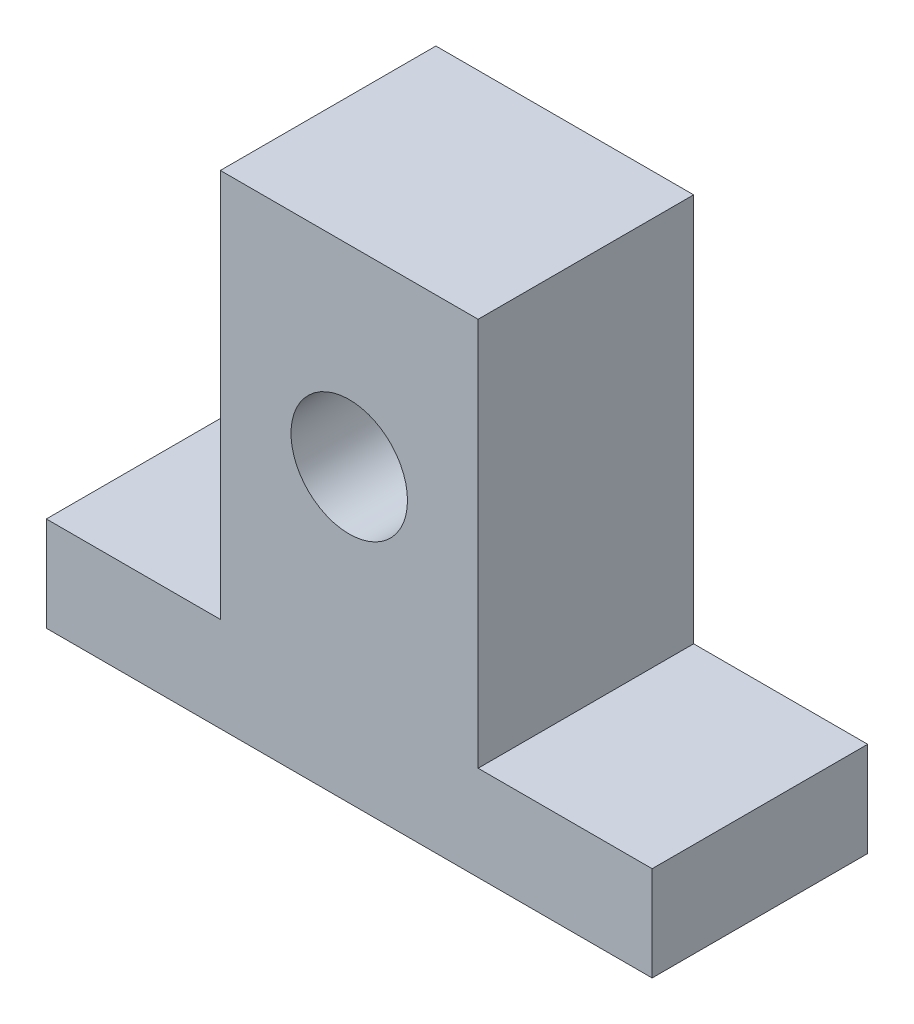
ISO-10303-21;
HEADER;
FILE_DESCRIPTION(('STEP AP214'),'2;1');
FILE_NAME('part.step','',(''),(''),'','','');
FILE_SCHEMA(('AUTOMOTIVE_DESIGN { 1 0 10303 214 1 1 1 1 }'));
ENDSEC;
DATA;
#1=APPLICATION_CONTEXT('core data for automotive mechanical design processes');
#2=APPLICATION_PROTOCOL_DEFINITION('international standard','automotive_design',2000,#1);
#3=PRODUCT_CONTEXT('',#1,'mechanical');
#4=PRODUCT('Part','Part','',(#3));
#5=PRODUCT_RELATED_PRODUCT_CATEGORY('part','',(#4));
#6=PRODUCT_DEFINITION_FORMATION('','',#4);
#7=PRODUCT_DEFINITION_CONTEXT('part definition',#1,'design');
#8=PRODUCT_DEFINITION('design','',#6,#7);
#9=PRODUCT_DEFINITION_SHAPE('','',#8);
#10=(LENGTH_UNIT() NAMED_UNIT(*) SI_UNIT(.MILLI.,.METRE.));
#11=(NAMED_UNIT(*) PLANE_ANGLE_UNIT() SI_UNIT($,.RADIAN.));
#12=(NAMED_UNIT(*) SI_UNIT($,.STERADIAN.) SOLID_ANGLE_UNIT());
#13=UNCERTAINTY_MEASURE_WITH_UNIT(LENGTH_MEASURE(1.E-05),#10,'distance_accuracy_value','');
#14=(GEOMETRIC_REPRESENTATION_CONTEXT(3) GLOBAL_UNCERTAINTY_ASSIGNED_CONTEXT((#13)) GLOBAL_UNIT_ASSIGNED_CONTEXT((#10,
#11,#12)) REPRESENTATION_CONTEXT('',''));
#15=CARTESIAN_POINT('',(0.,0.,0.));
#16=DIRECTION('',(0.,0.,1.));
#17=DIRECTION('',(1.,0.,0.));
#18=AXIS2_PLACEMENT_3D('',#15,#16,#17);
#19=CARTESIAN_POINT('',(0.,0.,14.8));
#20=DIRECTION('',(0.,0.,1.));
#21=DIRECTION('',(1.,0.,0.));
#22=AXIS2_PLACEMENT_3D('',#19,#20,#21);
#23=PLANE('',#22);
#24=DIRECTION('',(0.,-1.,0.));
#25=VECTOR('',#24,1.);
#26=CARTESIAN_POINT('',(-20.8,6.5,14.8));
#27=LINE('',#26,#25);
#28=CARTESIAN_POINT('',(-20.8,6.5,14.8));
#29=VERTEX_POINT('',#28);
#30=CARTESIAN_POINT('',(-20.8,0.,14.8));
#31=VERTEX_POINT('',#30);
#32=EDGE_CURVE('E164',#29,#31,#27,.T.);
#33=ORIENTED_EDGE('',*,*,#32,.T.);
#34=DIRECTION('',(1.,0.,0.));
#35=VECTOR('',#34,1.);
#36=CARTESIAN_POINT('',(-20.8,0.,14.8));
#37=LINE('',#36,#35);
#38=CARTESIAN_POINT('',(20.8,0.,14.8));
#39=VERTEX_POINT('',#38);
#40=EDGE_CURVE('E100',#31,#39,#37,.T.);
#41=ORIENTED_EDGE('',*,*,#40,.T.);
#42=DIRECTION('',(0.,1.,0.));
#43=VECTOR('',#42,1.);
#44=CARTESIAN_POINT('',(20.8,0.,14.8));
#45=LINE('',#44,#43);
#46=CARTESIAN_POINT('',(20.8,6.5,14.8));
#47=VERTEX_POINT('',#46);
#48=EDGE_CURVE('E185',#39,#47,#45,.T.);
#49=ORIENTED_EDGE('',*,*,#48,.T.);
#50=DIRECTION('',(-1.,0.,0.));
#51=VECTOR('',#50,1.);
#52=CARTESIAN_POINT('',(20.8,6.5,14.8));
#53=LINE('',#52,#51);
#54=CARTESIAN_POINT('',(8.85,6.5,14.8));
#55=VERTEX_POINT('',#54);
#56=EDGE_CURVE('E199',#47,#55,#53,.T.);
#57=ORIENTED_EDGE('',*,*,#56,.T.);
#58=DIRECTION('',(0.,1.,0.));
#59=VECTOR('',#58,1.);
#60=CARTESIAN_POINT('',(8.85,6.5,14.8));
#61=LINE('',#60,#59);
#62=CARTESIAN_POINT('',(8.85,33.2,14.8));
#63=VERTEX_POINT('',#62);
#64=EDGE_CURVE('E119',#55,#63,#61,.T.);
#65=ORIENTED_EDGE('',*,*,#64,.T.);
#66=DIRECTION('',(-1.,0.,0.));
#67=VECTOR('',#66,1.);
#68=CARTESIAN_POINT('',(8.85,33.2,14.8));
#69=LINE('',#68,#67);
#70=CARTESIAN_POINT('',(-8.85,33.2,14.8));
#71=VERTEX_POINT('',#70);
#72=EDGE_CURVE('E113',#63,#71,#69,.T.);
#73=ORIENTED_EDGE('',*,*,#72,.T.);
#74=DIRECTION('',(0.,-1.,0.));
#75=VECTOR('',#74,1.);
#76=CARTESIAN_POINT('',(-8.85,33.2,14.8));
#77=LINE('',#76,#75);
#78=CARTESIAN_POINT('',(-8.85,6.5,14.8));
#79=VERTEX_POINT('',#78);
#80=EDGE_CURVE('E117',#71,#79,#77,.T.);
#81=ORIENTED_EDGE('',*,*,#80,.T.);
#82=DIRECTION('',(-1.,0.,0.));
#83=VECTOR('',#82,1.);
#84=CARTESIAN_POINT('',(-8.85,6.5,14.8));
#85=LINE('',#84,#83);
#86=EDGE_CURVE('E57',#79,#29,#85,.T.);
#87=ORIENTED_EDGE('',*,*,#86,.T.);
#88=EDGE_LOOP('',(#33,#41,#49,#57,#65,#73,#81,#87));
#89=FACE_BOUND('',#88,.T.);
#90=CARTESIAN_POINT('',(0.,20.,14.8));
#91=DIRECTION('',(0.,0.,1.));
#92=DIRECTION('',(1.,0.,0.));
#93=AXIS2_PLACEMENT_3D('',#90,#91,#92);
#94=CIRCLE('',#93,4.);
#95=CARTESIAN_POINT('',(4.,20.,14.8));
#96=VERTEX_POINT('',#95);
#97=EDGE_CURVE('E146',#96,#96,#94,.T.);
#98=ORIENTED_EDGE('',*,*,#97,.F.);
#99=EDGE_LOOP('',(#98));
#100=FACE_BOUND('',#99,.T.);
#101=ADVANCED_FACE('F39',(#89,#100),#23,.T.);
#102=CARTESIAN_POINT('',(0.,0.,0.));
#103=DIRECTION('',(0.,0.,1.));
#104=DIRECTION('',(1.,0.,0.));
#105=AXIS2_PLACEMENT_3D('',#102,#103,#104);
#106=PLANE('',#105);
#107=DIRECTION('',(0.,-1.,0.));
#108=VECTOR('',#107,1.);
#109=CARTESIAN_POINT('',(-20.8,6.5,0.));
#110=LINE('',#109,#108);
#111=CARTESIAN_POINT('',(-20.8,6.5,0.));
#112=VERTEX_POINT('',#111);
#113=CARTESIAN_POINT('',(-20.8,0.,0.));
#114=VERTEX_POINT('',#113);
#115=EDGE_CURVE('E141',#112,#114,#110,.T.);
#116=ORIENTED_EDGE('',*,*,#115,.F.);
#117=DIRECTION('',(-1.,0.,0.));
#118=VECTOR('',#117,1.);
#119=CARTESIAN_POINT('',(-8.85,6.5,0.));
#120=LINE('',#119,#118);
#121=CARTESIAN_POINT('',(-8.85,6.5,0.));
#122=VERTEX_POINT('',#121);
#123=EDGE_CURVE('E92',#122,#112,#120,.T.);
#124=ORIENTED_EDGE('',*,*,#123,.F.);
#125=DIRECTION('',(0.,-1.,0.));
#126=VECTOR('',#125,1.);
#127=CARTESIAN_POINT('',(-8.85,33.2,0.));
#128=LINE('',#127,#126);
#129=CARTESIAN_POINT('',(-8.85,33.2,0.));
#130=VERTEX_POINT('',#129);
#131=EDGE_CURVE('E86',#130,#122,#128,.T.);
#132=ORIENTED_EDGE('',*,*,#131,.F.);
#133=DIRECTION('',(-1.,0.,0.));
#134=VECTOR('',#133,1.);
#135=CARTESIAN_POINT('',(8.85,33.2,0.));
#136=LINE('',#135,#134);
#137=CARTESIAN_POINT('',(8.85,33.2,0.));
#138=VERTEX_POINT('',#137);
#139=EDGE_CURVE('E128',#138,#130,#136,.T.);
#140=ORIENTED_EDGE('',*,*,#139,.F.);
#141=DIRECTION('',(0.,1.,0.));
#142=VECTOR('',#141,1.);
#143=CARTESIAN_POINT('',(8.85,6.5,0.));
#144=LINE('',#143,#142);
#145=CARTESIAN_POINT('',(8.85,6.5,0.));
#146=VERTEX_POINT('',#145);
#147=EDGE_CURVE('E155',#146,#138,#144,.T.);
#148=ORIENTED_EDGE('',*,*,#147,.F.);
#149=DIRECTION('',(-1.,0.,0.));
#150=VECTOR('',#149,1.);
#151=CARTESIAN_POINT('',(20.8,6.5,0.));
#152=LINE('',#151,#150);
#153=CARTESIAN_POINT('',(20.8,6.5,0.));
#154=VERTEX_POINT('',#153);
#155=EDGE_CURVE('E152',#154,#146,#152,.T.);
#156=ORIENTED_EDGE('',*,*,#155,.F.);
#157=DIRECTION('',(0.,1.,0.));
#158=VECTOR('',#157,1.);
#159=CARTESIAN_POINT('',(20.8,0.,0.));
#160=LINE('',#159,#158);
#161=CARTESIAN_POINT('',(20.8,0.,0.));
#162=VERTEX_POINT('',#161);
#163=EDGE_CURVE('E149',#162,#154,#160,.T.);
#164=ORIENTED_EDGE('',*,*,#163,.F.);
#165=DIRECTION('',(1.,0.,0.));
#166=VECTOR('',#165,1.);
#167=CARTESIAN_POINT('',(-20.8,0.,0.));
#168=LINE('',#167,#166);
#169=EDGE_CURVE('E145',#114,#162,#168,.T.);
#170=ORIENTED_EDGE('',*,*,#169,.F.);
#171=EDGE_LOOP('',(#116,#124,#132,#140,#148,#156,#164,#170));
#172=FACE_BOUND('',#171,.T.);
#173=CARTESIAN_POINT('',(0.,20.,0.));
#174=DIRECTION('',(0.,0.,1.));
#175=DIRECTION('',(1.,0.,0.));
#176=AXIS2_PLACEMENT_3D('',#173,#174,#175);
#177=CIRCLE('',#176,4.);
#178=CARTESIAN_POINT('',(4.,20.,0.));
#179=VERTEX_POINT('',#178);
#180=EDGE_CURVE('E209',#179,#179,#177,.T.);
#181=ORIENTED_EDGE('',*,*,#180,.T.);
#182=EDGE_LOOP('',(#181));
#183=FACE_BOUND('',#182,.T.);
#184=ADVANCED_FACE('F189',(#172,#183),#106,.F.);
#185=CARTESIAN_POINT('',(-20.8,6.5,14.8));
#186=DIRECTION('',(1.,0.,0.));
#187=DIRECTION('',(0.,0.,-1.));
#188=AXIS2_PLACEMENT_3D('',#185,#186,#187);
#189=PLANE('',#188);
#190=ORIENTED_EDGE('',*,*,#115,.T.);
#191=DIRECTION('',(0.,0.,-1.));
#192=VECTOR('',#191,1.);
#193=CARTESIAN_POINT('',(-20.8,0.,14.8));
#194=LINE('',#193,#192);
#195=EDGE_CURVE('E11',#31,#114,#194,.T.);
#196=ORIENTED_EDGE('',*,*,#195,.F.);
#197=ORIENTED_EDGE('',*,*,#32,.F.);
#198=DIRECTION('',(0.,0.,-1.));
#199=VECTOR('',#198,1.);
#200=CARTESIAN_POINT('',(-20.8,6.5,14.8));
#201=LINE('',#200,#199);
#202=EDGE_CURVE('E137',#29,#112,#201,.T.);
#203=ORIENTED_EDGE('',*,*,#202,.T.);
#204=EDGE_LOOP('',(#190,#196,#197,#203));
#205=FACE_BOUND('',#204,.T.);
#206=ADVANCED_FACE('F41',(#205),#189,.F.);
#207=CARTESIAN_POINT('',(-20.8,0.,14.8));
#208=DIRECTION('',(0.,1.,0.));
#209=DIRECTION('',(-1.,0.,0.));
#210=AXIS2_PLACEMENT_3D('',#207,#208,#209);
#211=PLANE('',#210);
#212=ORIENTED_EDGE('',*,*,#169,.T.);
#213=DIRECTION('',(0.,0.,-1.));
#214=VECTOR('',#213,1.);
#215=CARTESIAN_POINT('',(20.8,0.,14.8));
#216=LINE('',#215,#214);
#217=EDGE_CURVE('E49',#39,#162,#216,.T.);
#218=ORIENTED_EDGE('',*,*,#217,.F.);
#219=ORIENTED_EDGE('',*,*,#40,.F.);
#220=ORIENTED_EDGE('',*,*,#195,.T.);
#221=EDGE_LOOP('',(#212,#218,#219,#220));
#222=FACE_BOUND('',#221,.T.);
#223=ADVANCED_FACE('F239',(#222),#211,.F.);
#224=CARTESIAN_POINT('',(20.8,0.,14.8));
#225=DIRECTION('',(-1.,0.,0.));
#226=DIRECTION('',(0.,0.,1.));
#227=AXIS2_PLACEMENT_3D('',#224,#225,#226);
#228=PLANE('',#227);
#229=ORIENTED_EDGE('',*,*,#163,.T.);
#230=DIRECTION('',(0.,0.,-1.));
#231=VECTOR('',#230,1.);
#232=CARTESIAN_POINT('',(20.8,6.5,14.8));
#233=LINE('',#232,#231);
#234=EDGE_CURVE('E175',#47,#154,#233,.T.);
#235=ORIENTED_EDGE('',*,*,#234,.F.);
#236=ORIENTED_EDGE('',*,*,#48,.F.);
#237=ORIENTED_EDGE('',*,*,#217,.T.);
#238=EDGE_LOOP('',(#229,#235,#236,#237));
#239=FACE_BOUND('',#238,.T.);
#240=ADVANCED_FACE('F183',(#239),#228,.F.);
#241=CARTESIAN_POINT('',(20.8,6.5,14.8));
#242=DIRECTION('',(0.,-1.,0.));
#243=DIRECTION('',(1.,0.,0.));
#244=AXIS2_PLACEMENT_3D('',#241,#242,#243);
#245=PLANE('',#244);
#246=ORIENTED_EDGE('',*,*,#155,.T.);
#247=DIRECTION('',(0.,0.,-1.));
#248=VECTOR('',#247,1.);
#249=CARTESIAN_POINT('',(8.85,6.5,14.8));
#250=LINE('',#249,#248);
#251=EDGE_CURVE('E171',#55,#146,#250,.T.);
#252=ORIENTED_EDGE('',*,*,#251,.F.);
#253=ORIENTED_EDGE('',*,*,#56,.F.);
#254=ORIENTED_EDGE('',*,*,#234,.T.);
#255=EDGE_LOOP('',(#246,#252,#253,#254));
#256=FACE_BOUND('',#255,.T.);
#257=ADVANCED_FACE('F194',(#256),#245,.F.);
#258=CARTESIAN_POINT('',(8.85,6.5,14.8));
#259=DIRECTION('',(-1.,0.,0.));
#260=DIRECTION('',(0.,-1.,0.));
#261=AXIS2_PLACEMENT_3D('',#258,#259,#260);
#262=PLANE('',#261);
#263=ORIENTED_EDGE('',*,*,#147,.T.);
#264=DIRECTION('',(0.,0.,-1.));
#265=VECTOR('',#264,1.);
#266=CARTESIAN_POINT('',(8.85,33.2,14.8));
#267=LINE('',#266,#265);
#268=EDGE_CURVE('E130',#63,#138,#267,.T.);
#269=ORIENTED_EDGE('',*,*,#268,.F.);
#270=ORIENTED_EDGE('',*,*,#64,.F.);
#271=ORIENTED_EDGE('',*,*,#251,.T.);
#272=EDGE_LOOP('',(#263,#269,#270,#271));
#273=FACE_BOUND('',#272,.T.);
#274=ADVANCED_FACE('F197',(#273),#262,.F.);
#275=CARTESIAN_POINT('',(8.85,33.2,14.8));
#276=DIRECTION('',(0.,-1.,0.));
#277=DIRECTION('',(0.,0.,-1.));
#278=AXIS2_PLACEMENT_3D('',#275,#276,#277);
#279=PLANE('',#278);
#280=ORIENTED_EDGE('',*,*,#139,.T.);
#281=DIRECTION('',(0.,0.,-1.));
#282=VECTOR('',#281,1.);
#283=CARTESIAN_POINT('',(-8.85,33.2,14.8));
#284=LINE('',#283,#282);
#285=EDGE_CURVE('E125',#71,#130,#284,.T.);
#286=ORIENTED_EDGE('',*,*,#285,.F.);
#287=ORIENTED_EDGE('',*,*,#72,.F.);
#288=ORIENTED_EDGE('',*,*,#268,.T.);
#289=EDGE_LOOP('',(#280,#286,#287,#288));
#290=FACE_BOUND('',#289,.T.);
#291=ADVANCED_FACE('F126',(#290),#279,.F.);
#292=CARTESIAN_POINT('',(-8.85,33.2,14.8));
#293=DIRECTION('',(1.,0.,0.));
#294=DIRECTION('',(0.,1.,0.));
#295=AXIS2_PLACEMENT_3D('',#292,#293,#294);
#296=PLANE('',#295);
#297=ORIENTED_EDGE('',*,*,#131,.T.);
#298=DIRECTION('',(0.,0.,-1.));
#299=VECTOR('',#298,1.);
#300=CARTESIAN_POINT('',(-8.85,6.5,14.8));
#301=LINE('',#300,#299);
#302=EDGE_CURVE('E131',#79,#122,#301,.T.);
#303=ORIENTED_EDGE('',*,*,#302,.F.);
#304=ORIENTED_EDGE('',*,*,#80,.F.);
#305=ORIENTED_EDGE('',*,*,#285,.T.);
#306=EDGE_LOOP('',(#297,#303,#304,#305));
#307=FACE_BOUND('',#306,.T.);
#308=ADVANCED_FACE('F133',(#307),#296,.F.);
#309=CARTESIAN_POINT('',(-8.85,6.5,14.8));
#310=DIRECTION('',(0.,-1.,0.));
#311=DIRECTION('',(1.,0.,0.));
#312=AXIS2_PLACEMENT_3D('',#309,#310,#311);
#313=PLANE('',#312);
#314=ORIENTED_EDGE('',*,*,#123,.T.);
#315=ORIENTED_EDGE('',*,*,#202,.F.);
#316=ORIENTED_EDGE('',*,*,#86,.F.);
#317=ORIENTED_EDGE('',*,*,#302,.T.);
#318=EDGE_LOOP('',(#314,#315,#316,#317));
#319=FACE_BOUND('',#318,.T.);
#320=ADVANCED_FACE('F227',(#319),#313,.F.);
#321=CARTESIAN_POINT('',(0.,20.,14.8));
#322=DIRECTION('',(0.,0.,-1.));
#323=DIRECTION('',(-1.,0.,0.));
#324=AXIS2_PLACEMENT_3D('',#321,#322,#323);
#325=CYLINDRICAL_SURFACE('',#324,4.);
#326=ORIENTED_EDGE('',*,*,#97,.T.);
#327=EDGE_LOOP('',(#326));
#328=FACE_BOUND('',#327,.T.);
#329=ORIENTED_EDGE('',*,*,#180,.F.);
#330=EDGE_LOOP('',(#329));
#331=FACE_BOUND('',#330,.T.);
#332=ADVANCED_FACE('F217',(#328,#331),#325,.F.);
#333=CLOSED_SHELL('',(#101,#184,#206,#223,#240,#257,#274,#291,#308,#320,#332));
#334=MANIFOLD_SOLID_BREP('B2',#333);
#335=ADVANCED_BREP_SHAPE_REPRESENTATION('',(#18,#334),#14);
#336=SHAPE_DEFINITION_REPRESENTATION(#9,#335);
ENDSEC;
END-ISO-10303-21;
